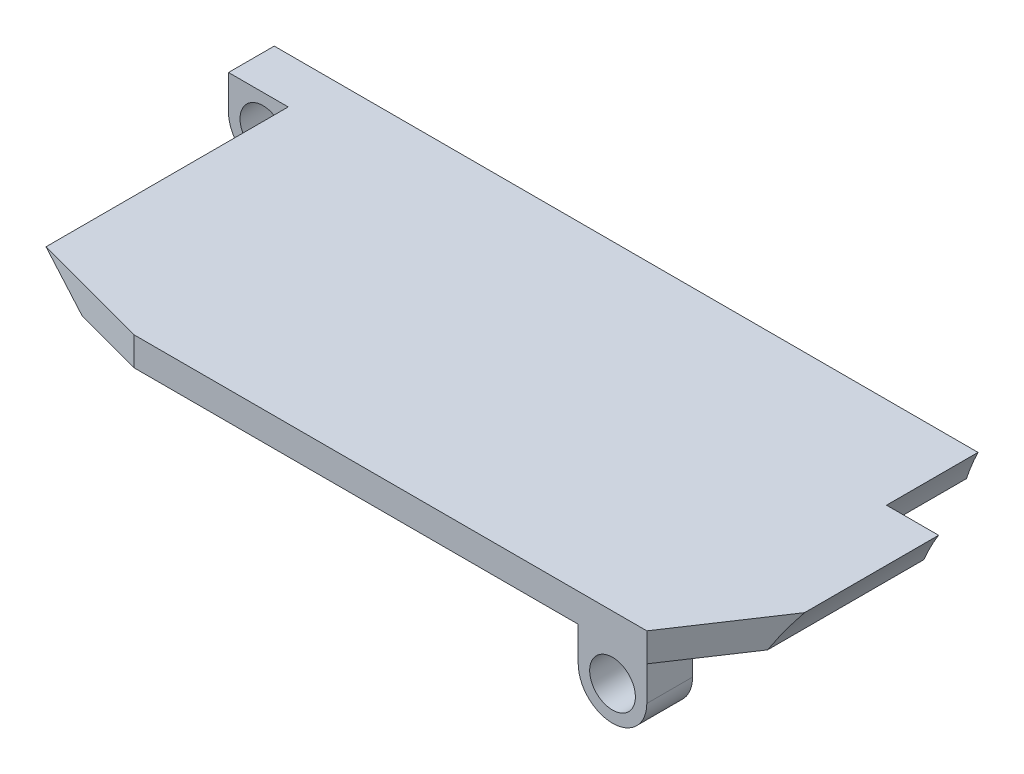
ISO-10303-21;
HEADER;
FILE_DESCRIPTION(('STEP AP214'),'2;1');
FILE_NAME('part.step','',(''),(''),'','','');
FILE_SCHEMA(('AUTOMOTIVE_DESIGN { 1 0 10303 214 1 1 1 1 }'));
ENDSEC;
DATA;
#1=APPLICATION_CONTEXT('core data for automotive mechanical design processes');
#2=APPLICATION_PROTOCOL_DEFINITION('international standard','automotive_design',2000,#1);
#3=PRODUCT_CONTEXT('',#1,'mechanical');
#4=PRODUCT('Part','Part','',(#3));
#5=PRODUCT_RELATED_PRODUCT_CATEGORY('part','',(#4));
#6=PRODUCT_DEFINITION_FORMATION('','',#4);
#7=PRODUCT_DEFINITION_CONTEXT('part definition',#1,'design');
#8=PRODUCT_DEFINITION('design','',#6,#7);
#9=PRODUCT_DEFINITION_SHAPE('','',#8);
#10=(LENGTH_UNIT() NAMED_UNIT(*) SI_UNIT(.MILLI.,.METRE.));
#11=(NAMED_UNIT(*) PLANE_ANGLE_UNIT() SI_UNIT($,.RADIAN.));
#12=(NAMED_UNIT(*) SI_UNIT($,.STERADIAN.) SOLID_ANGLE_UNIT());
#13=UNCERTAINTY_MEASURE_WITH_UNIT(LENGTH_MEASURE(1.E-05),#10,'distance_accuracy_value','');
#14=(GEOMETRIC_REPRESENTATION_CONTEXT(3) GLOBAL_UNCERTAINTY_ASSIGNED_CONTEXT((#13)) GLOBAL_UNIT_ASSIGNED_CONTEXT((#10,
#11,#12)) REPRESENTATION_CONTEXT('',''));
#15=CARTESIAN_POINT('',(0.,0.,0.));
#16=DIRECTION('',(0.,0.,1.));
#17=DIRECTION('',(1.,0.,0.));
#18=AXIS2_PLACEMENT_3D('',#15,#16,#17);
#19=CARTESIAN_POINT('',(-14.6132968385494,-25.3109725904531,-16.));
#20=DIRECTION('',(0.500000000000001,0.866025403784438,0.));
#21=DIRECTION('',(0.866025403784438,-0.500000000000001,0.));
#22=AXIS2_PLACEMENT_3D('',#19,#20,#21);
#23=PLANE('',#22);
#24=DIRECTION('',(0.866025403784438,-0.500000000000001,0.));
#25=VECTOR('',#24,1.);
#26=CARTESIAN_POINT('',(-14.6132968385494,-25.3109725904531,-14.));
#27=LINE('',#26,#25);
#28=CARTESIAN_POINT('',(-15.5849298668677,-24.75,-14.));
#29=VERTEX_POINT('',#28);
#30=CARTESIAN_POINT('',(-13.4198663574066,-26.,-14.));
#31=VERTEX_POINT('',#30);
#32=EDGE_CURVE('E182',#29,#31,#27,.T.);
#33=ORIENTED_EDGE('',*,*,#32,.T.);
#34=DIRECTION('',(0.,0.,1.));
#35=VECTOR('',#34,1.);
#36=CARTESIAN_POINT('',(-13.4198663574066,-26.,-16.));
#37=LINE('',#36,#35);
#38=CARTESIAN_POINT('',(-13.4198663574066,-26.,-2.82810536129617));
#39=VERTEX_POINT('',#38);
#40=EDGE_CURVE('E256',#31,#39,#37,.T.);
#41=ORIENTED_EDGE('',*,*,#40,.T.);
#42=DIRECTION('',(0.843610022961952,-0.48705847384815,0.22604462437945));
#43=VECTOR('',#42,1.);
#44=CARTESIAN_POINT('',(-17.0641119412203,-23.8959938311921,-3.80457802249971));
#45=LINE('',#44,#43);
#46=CARTESIAN_POINT('',(-15.5849298668677,-24.75,-3.40823238021835));
#47=VERTEX_POINT('',#46);
#48=EDGE_CURVE('E213',#47,#39,#45,.T.);
#49=ORIENTED_EDGE('',*,*,#48,.F.);
#50=DIRECTION('',(0.,0.,1.));
#51=VECTOR('',#50,1.);
#52=CARTESIAN_POINT('',(-15.5849298668677,-24.75,-16.));
#53=LINE('',#52,#51);
#54=EDGE_CURVE('E260',#29,#47,#53,.T.);
#55=ORIENTED_EDGE('',*,*,#54,.F.);
#56=EDGE_LOOP('',(#33,#41,#49,#55));
#57=FACE_BOUND('',#56,.T.);
#58=ADVANCED_FACE('F34',(#57),#23,.F.);
#59=CARTESIAN_POINT('',(22.5,-29.5,-16.));
#60=DIRECTION('',(0.,0.,1.));
#61=DIRECTION('',(1.,0.,0.));
#62=AXIS2_PLACEMENT_3D('',#59,#60,#61);
#63=CYLINDRICAL_SURFACE('',#62,9.00000000000001);
#64=CARTESIAN_POINT('',(22.5,-29.5,-17.605551275464));
#65=DIRECTION('',(0.832050294337844,0.,0.554700196225229));
#66=DIRECTION('',(-0.554700196225229,0.,0.832050294337844));
#67=AXIS2_PLACEMENT_3D('',#64,#65,#66);
#68=ELLIPSE('',#67,16.224980739588,9.00000000000001);
#69=CARTESIAN_POINT('',(14.8555575742897,-24.75,-6.1388876368985));
#70=VERTEX_POINT('',#69);
#71=CARTESIAN_POINT('',(14.2084380241115,-26.,-5.16820831163123));
#72=VERTEX_POINT('',#71);
#73=EDGE_CURVE('E222',#70,#72,#68,.T.);
#74=ORIENTED_EDGE('',*,*,#73,.T.);
#75=DIRECTION('',(0.,0.,1.));
#76=VECTOR('',#75,1.);
#77=CARTESIAN_POINT('',(14.2084380241115,-26.,-16.));
#78=LINE('',#77,#76);
#79=CARTESIAN_POINT('',(14.2084380241115,-26.,-12.));
#80=VERTEX_POINT('',#79);
#81=EDGE_CURVE('E249',#80,#72,#78,.T.);
#82=ORIENTED_EDGE('',*,*,#81,.F.);
#83=CARTESIAN_POINT('',(22.5,-29.5,-12.));
#84=DIRECTION('',(0.,0.,1.));
#85=DIRECTION('',(-1.,0.,0.));
#86=AXIS2_PLACEMENT_3D('',#83,#84,#85);
#87=CIRCLE('',#86,9.00000000000001);
#88=CARTESIAN_POINT('',(14.8555575742897,-24.75,-12.));
#89=VERTEX_POINT('',#88);
#90=EDGE_CURVE('E238',#89,#80,#87,.T.);
#91=ORIENTED_EDGE('',*,*,#90,.F.);
#92=DIRECTION('',(0.,0.,1.));
#93=VECTOR('',#92,1.);
#94=CARTESIAN_POINT('',(14.8555575742897,-24.75,-16.));
#95=LINE('',#94,#93);
#96=EDGE_CURVE('E42',#89,#70,#95,.T.);
#97=ORIENTED_EDGE('',*,*,#96,.T.);
#98=EDGE_LOOP('',(#74,#82,#91,#97));
#99=FACE_BOUND('',#98,.T.);
#100=ADVANCED_FACE('F36',(#99),#63,.F.);
#101=CARTESIAN_POINT('',(0.,-24.75,-16.));
#102=DIRECTION('',(0.,1.,0.));
#103=DIRECTION('',(1.,0.,0.));
#104=AXIS2_PLACEMENT_3D('',#101,#102,#103);
#105=PLANE('',#104);
#106=DIRECTION('',(0.96592582628907,0.,0.258819045102514));
#107=VECTOR('',#106,1.);
#108=CARTESIAN_POINT('',(-10.329335075029,-24.75,-2.));
#109=LINE('',#108,#107);
#110=CARTESIAN_POINT('',(-10.329335075029,-24.75,-2.));
#111=VERTEX_POINT('',#110);
#112=EDGE_CURVE('E199',#47,#111,#109,.T.);
#113=ORIENTED_EDGE('',*,*,#112,.T.);
#114=DIRECTION('',(1.,0.,0.));
#115=VECTOR('',#114,1.);
#116=CARTESIAN_POINT('',(0.,-24.75,-2.));
#117=LINE('',#116,#115);
#118=CARTESIAN_POINT('',(12.0962991496907,-24.75,-2.));
#119=VERTEX_POINT('',#118);
#120=EDGE_CURVE('E241',#111,#119,#117,.T.);
#121=ORIENTED_EDGE('',*,*,#120,.T.);
#122=DIRECTION('',(0.554700196225229,0.,-0.832050294337844));
#123=VECTOR('',#122,1.);
#124=CARTESIAN_POINT('',(12.0962991496907,-24.75,-2.));
#125=LINE('',#124,#123);
#126=EDGE_CURVE('E216',#119,#70,#125,.T.);
#127=ORIENTED_EDGE('',*,*,#126,.T.);
#128=ORIENTED_EDGE('',*,*,#96,.F.);
#129=DIRECTION('',(-1.,0.,0.));
#130=VECTOR('',#129,1.);
#131=CARTESIAN_POINT('',(12.5784325835078,-24.75,-12.));
#132=LINE('',#131,#130);
#133=CARTESIAN_POINT('',(12.5784325835078,-24.75,-12.));
#134=VERTEX_POINT('',#133);
#135=EDGE_CURVE('E228',#89,#134,#132,.T.);
#136=ORIENTED_EDGE('',*,*,#135,.T.);
#137=DIRECTION('',(0.,0.,-1.));
#138=VECTOR('',#137,1.);
#139=CARTESIAN_POINT('',(12.5784325835078,-24.75,-12.));
#140=LINE('',#139,#138);
#141=CARTESIAN_POINT('',(12.5784325835078,-24.75,-16.));
#142=VERTEX_POINT('',#141);
#143=EDGE_CURVE('E231',#134,#142,#140,.T.);
#144=ORIENTED_EDGE('',*,*,#143,.T.);
#145=DIRECTION('',(1.,0.,0.));
#146=VECTOR('',#145,1.);
#147=CARTESIAN_POINT('',(0.,-24.75,-16.));
#148=LINE('',#147,#146);
#149=CARTESIAN_POINT('',(-18.1957444455323,-24.75,-16.));
#150=VERTEX_POINT('',#149);
#151=EDGE_CURVE('E242',#150,#142,#148,.T.);
#152=ORIENTED_EDGE('',*,*,#151,.F.);
#153=DIRECTION('',(0.,0.,-1.));
#154=VECTOR('',#153,1.);
#155=CARTESIAN_POINT('',(-18.1957444455323,-24.75,-14.));
#156=LINE('',#155,#154);
#157=CARTESIAN_POINT('',(-18.1957444455323,-24.75,-14.));
#158=VERTEX_POINT('',#157);
#159=EDGE_CURVE('E185',#158,#150,#156,.T.);
#160=ORIENTED_EDGE('',*,*,#159,.F.);
#161=DIRECTION('',(-1.,0.,0.));
#162=VECTOR('',#161,1.);
#163=CARTESIAN_POINT('',(0.,-24.75,-14.));
#164=LINE('',#163,#162);
#165=EDGE_CURVE('E170',#29,#158,#164,.T.);
#166=ORIENTED_EDGE('',*,*,#165,.F.);
#167=ORIENTED_EDGE('',*,*,#54,.T.);
#168=EDGE_LOOP('',(#113,#121,#127,#128,#136,#144,#152,#160,#166,#167));
#169=FACE_BOUND('',#168,.T.);
#170=ADVANCED_FACE('F280',(#169),#105,.T.);
#171=CARTESIAN_POINT('',(0.,-26.,-16.));
#172=DIRECTION('',(0.,1.,0.));
#173=DIRECTION('',(0.,0.,-1.));
#174=AXIS2_PLACEMENT_3D('',#171,#172,#173);
#175=PLANE('',#174);
#176=DIRECTION('',(-1.,0.,0.));
#177=VECTOR('',#176,1.);
#178=CARTESIAN_POINT('',(0.,-26.,-4.));
#179=LINE('',#178,#177);
#180=CARTESIAN_POINT('',(12.0962991496907,-26.,-4.));
#181=VERTEX_POINT('',#180);
#182=CARTESIAN_POINT('',(9.09629914969067,-26.,-4.));
#183=VERTEX_POINT('',#182);
#184=EDGE_CURVE('E157',#181,#183,#179,.T.);
#185=ORIENTED_EDGE('',*,*,#184,.T.);
#186=DIRECTION('',(0.,0.,1.));
#187=VECTOR('',#186,1.);
#188=CARTESIAN_POINT('',(9.09629914969067,-26.,-4.));
#189=LINE('',#188,#187);
#190=CARTESIAN_POINT('',(9.09629914969067,-26.,-2.));
#191=VERTEX_POINT('',#190);
#192=EDGE_CURVE('E165',#183,#191,#189,.T.);
#193=ORIENTED_EDGE('',*,*,#192,.T.);
#194=DIRECTION('',(1.,0.,0.));
#195=VECTOR('',#194,1.);
#196=CARTESIAN_POINT('',(0.,-26.,-2.));
#197=LINE('',#196,#195);
#198=CARTESIAN_POINT('',(-10.329335075029,-26.,-2.));
#199=VERTEX_POINT('',#198);
#200=EDGE_CURVE('E246',#199,#191,#197,.T.);
#201=ORIENTED_EDGE('',*,*,#200,.F.);
#202=DIRECTION('',(0.96592582628907,0.,0.258819045102514));
#203=VECTOR('',#202,1.);
#204=CARTESIAN_POINT('',(-10.329335075029,-26.,-2.));
#205=LINE('',#204,#203);
#206=EDGE_CURVE('E206',#39,#199,#205,.T.);
#207=ORIENTED_EDGE('',*,*,#206,.F.);
#208=ORIENTED_EDGE('',*,*,#40,.F.);
#209=CARTESIAN_POINT('',(-13.4198663574066,-26.,-16.));
#210=VERTEX_POINT('',#209);
#211=EDGE_CURVE('E257',#210,#31,#37,.T.);
#212=ORIENTED_EDGE('',*,*,#211,.F.);
#213=DIRECTION('',(1.,0.,0.));
#214=VECTOR('',#213,1.);
#215=CARTESIAN_POINT('',(0.,-26.,-16.));
#216=LINE('',#215,#214);
#217=CARTESIAN_POINT('',(12.0716731926929,-26.,-16.));
#218=VERTEX_POINT('',#217);
#219=EDGE_CURVE('E245',#210,#218,#216,.T.);
#220=ORIENTED_EDGE('',*,*,#219,.T.);
#221=DIRECTION('',(0.,0.,-1.));
#222=VECTOR('',#221,1.);
#223=CARTESIAN_POINT('',(12.0716731926929,-26.,-12.));
#224=LINE('',#223,#222);
#225=CARTESIAN_POINT('',(12.0716731926929,-26.,-12.));
#226=VERTEX_POINT('',#225);
#227=EDGE_CURVE('E235',#226,#218,#224,.T.);
#228=ORIENTED_EDGE('',*,*,#227,.F.);
#229=DIRECTION('',(1.,0.,0.));
#230=VECTOR('',#229,1.);
#231=CARTESIAN_POINT('',(0.,-26.,-12.));
#232=LINE('',#231,#230);
#233=EDGE_CURVE('E11',#226,#80,#232,.T.);
#234=ORIENTED_EDGE('',*,*,#233,.T.);
#235=ORIENTED_EDGE('',*,*,#81,.T.);
#236=DIRECTION('',(0.554700196225229,0.,-0.832050294337844));
#237=VECTOR('',#236,1.);
#238=CARTESIAN_POINT('',(12.0962991496907,-26.,-2.));
#239=LINE('',#238,#237);
#240=CARTESIAN_POINT('',(12.0962991496907,-26.,-2.));
#241=VERTEX_POINT('',#240);
#242=EDGE_CURVE('E217',#241,#72,#239,.T.);
#243=ORIENTED_EDGE('',*,*,#242,.F.);
#244=DIRECTION('',(0.,0.,1.));
#245=VECTOR('',#244,1.);
#246=CARTESIAN_POINT('',(12.0962991496907,-26.,-4.));
#247=LINE('',#246,#245);
#248=EDGE_CURVE('E190',#181,#241,#247,.T.);
#249=ORIENTED_EDGE('',*,*,#248,.F.);
#250=EDGE_LOOP('',(#185,#193,#201,#207,#208,#212,#220,#228,#234,#235,#243,#249));
#251=FACE_BOUND('',#250,.T.);
#252=ADVANCED_FACE('F274',(#251),#175,.F.);
#253=CARTESIAN_POINT('',(0.,0.,-16.));
#254=DIRECTION('',(0.,0.,-1.));
#255=DIRECTION('',(-1.,0.,0.));
#256=AXIS2_PLACEMENT_3D('',#253,#254,#255);
#257=PLANE('',#256);
#258=CARTESIAN_POINT('',(-16.6917910527879,-26.25,-16.));
#259=DIRECTION('',(0.,0.,1.));
#260=DIRECTION('',(-1.,0.,0.));
#261=AXIS2_PLACEMENT_3D('',#258,#259,#260);
#262=CIRCLE('',#261,1.);
#263=CARTESIAN_POINT('',(-17.6917910527879,-26.25,-16.));
#264=VERTEX_POINT('',#263);
#265=EDGE_CURVE('E326',#264,#264,#262,.T.);
#266=ORIENTED_EDGE('',*,*,#265,.T.);
#267=EDGE_LOOP('',(#266));
#268=FACE_BOUND('',#267,.T.);
#269=CARTESIAN_POINT('',(22.5,-29.5,-16.));
#270=DIRECTION('',(0.,0.,1.));
#271=DIRECTION('',(-1.,0.,0.));
#272=AXIS2_PLACEMENT_3D('',#269,#270,#271);
#273=CIRCLE('',#272,11.);
#274=EDGE_CURVE('E225',#142,#218,#273,.T.);
#275=ORIENTED_EDGE('',*,*,#274,.T.);
#276=ORIENTED_EDGE('',*,*,#219,.F.);
#277=DIRECTION('',(0.988926049356473,0.148409126755062,0.));
#278=VECTOR('',#277,1.);
#279=CARTESIAN_POINT('',(3.5203307714882,-23.4577675807065,-16.));
#280=LINE('',#279,#278);
#281=CARTESIAN_POINT('',(-15.0857444455323,-26.25,-16.));
#282=VERTEX_POINT('',#281);
#283=EDGE_CURVE('E174',#282,#210,#280,.T.);
#284=ORIENTED_EDGE('',*,*,#283,.F.);
#285=DIRECTION('',(1.,0.,0.));
#286=VECTOR('',#285,1.);
#287=CARTESIAN_POINT('',(0.,-26.25,-16.));
#288=LINE('',#287,#286);
#289=CARTESIAN_POINT('',(-15.1957444455323,-26.25,-16.));
#290=VERTEX_POINT('',#289);
#291=EDGE_CURVE('E193',#290,#282,#288,.T.);
#292=ORIENTED_EDGE('',*,*,#291,.F.);
#293=CARTESIAN_POINT('',(-16.6957444455323,-26.25,-16.));
#294=DIRECTION('',(0.,0.,1.));
#295=DIRECTION('',(-1.,0.,0.));
#296=AXIS2_PLACEMENT_3D('',#293,#294,#295);
#297=CIRCLE('',#296,1.5);
#298=CARTESIAN_POINT('',(-18.1957444455323,-26.25,-16.));
#299=VERTEX_POINT('',#298);
#300=EDGE_CURVE('E189',#299,#290,#297,.T.);
#301=ORIENTED_EDGE('',*,*,#300,.F.);
#302=DIRECTION('',(0.,-1.,0.));
#303=VECTOR('',#302,1.);
#304=CARTESIAN_POINT('',(-18.1957444455323,0.,-16.));
#305=LINE('',#304,#303);
#306=EDGE_CURVE('E186',#150,#299,#305,.T.);
#307=ORIENTED_EDGE('',*,*,#306,.F.);
#308=ORIENTED_EDGE('',*,*,#151,.T.);
#309=EDGE_LOOP('',(#275,#276,#284,#292,#301,#307,#308));
#310=FACE_BOUND('',#309,.T.);
#311=ADVANCED_FACE('F287',(#268,#310),#257,.T.);
#312=CARTESIAN_POINT('',(0.,0.,-2.));
#313=DIRECTION('',(0.,0.,-1.));
#314=DIRECTION('',(-1.,0.,0.));
#315=AXIS2_PLACEMENT_3D('',#312,#313,#314);
#316=PLANE('',#315);
#317=CARTESIAN_POINT('',(10.5962991496907,-27.5,-2.));
#318=DIRECTION('',(0.,0.,-1.));
#319=DIRECTION('',(1.,0.,0.));
#320=AXIS2_PLACEMENT_3D('',#317,#318,#319);
#321=CIRCLE('',#320,0.999999999999987);
#322=CARTESIAN_POINT('',(11.5962991496907,-27.5,-2.));
#323=VERTEX_POINT('',#322);
#324=EDGE_CURVE('E332',#323,#323,#321,.T.);
#325=ORIENTED_EDGE('',*,*,#324,.T.);
#326=EDGE_LOOP('',(#325));
#327=FACE_BOUND('',#326,.T.);
#328=ORIENTED_EDGE('',*,*,#200,.T.);
#329=DIRECTION('',(0.,1.,0.));
#330=VECTOR('',#329,1.);
#331=CARTESIAN_POINT('',(9.09629914969062,0.,-2.));
#332=LINE('',#331,#330);
#333=CARTESIAN_POINT('',(9.09629914969068,-27.5,-2.));
#334=VERTEX_POINT('',#333);
#335=EDGE_CURVE('E158',#334,#191,#332,.T.);
#336=ORIENTED_EDGE('',*,*,#335,.F.);
#337=CARTESIAN_POINT('',(10.5962991496907,-27.5,-2.));
#338=DIRECTION('',(0.,0.,-1.));
#339=DIRECTION('',(1.,0.,0.));
#340=AXIS2_PLACEMENT_3D('',#337,#338,#339);
#341=CIRCLE('',#340,1.5);
#342=CARTESIAN_POINT('',(12.0962991496907,-27.5,-2.));
#343=VERTEX_POINT('',#342);
#344=EDGE_CURVE('E316',#343,#334,#341,.T.);
#345=ORIENTED_EDGE('',*,*,#344,.F.);
#346=DIRECTION('',(0.,-1.,0.));
#347=VECTOR('',#346,1.);
#348=CARTESIAN_POINT('',(12.0962991496907,0.,-2.));
#349=LINE('',#348,#347);
#350=EDGE_CURVE('E162',#241,#343,#349,.T.);
#351=ORIENTED_EDGE('',*,*,#350,.F.);
#352=DIRECTION('',(0.,1.,0.));
#353=VECTOR('',#352,1.);
#354=CARTESIAN_POINT('',(12.0962991496907,-26.,-2.));
#355=LINE('',#354,#353);
#356=EDGE_CURVE('E219',#241,#119,#355,.T.);
#357=ORIENTED_EDGE('',*,*,#356,.T.);
#358=ORIENTED_EDGE('',*,*,#120,.F.);
#359=DIRECTION('',(0.,1.,0.));
#360=VECTOR('',#359,1.);
#361=CARTESIAN_POINT('',(-10.329335075029,-26.,-2.));
#362=LINE('',#361,#360);
#363=EDGE_CURVE('E209',#199,#111,#362,.T.);
#364=ORIENTED_EDGE('',*,*,#363,.F.);
#365=EDGE_LOOP('',(#328,#336,#345,#351,#357,#358,#364));
#366=FACE_BOUND('',#365,.T.);
#367=ADVANCED_FACE('F314',(#327,#366),#316,.F.);
#368=CARTESIAN_POINT('',(22.5,-29.5,-12.));
#369=DIRECTION('',(0.,0.,-1.));
#370=DIRECTION('',(-1.,0.,0.));
#371=AXIS2_PLACEMENT_3D('',#368,#369,#370);
#372=CYLINDRICAL_SURFACE('',#371,11.);
#373=CARTESIAN_POINT('',(22.5,-29.5,-12.));
#374=DIRECTION('',(0.,0.,1.));
#375=DIRECTION('',(-1.,0.,0.));
#376=AXIS2_PLACEMENT_3D('',#373,#374,#375);
#377=CIRCLE('',#376,11.);
#378=EDGE_CURVE('E226',#134,#226,#377,.T.);
#379=ORIENTED_EDGE('',*,*,#378,.T.);
#380=ORIENTED_EDGE('',*,*,#227,.T.);
#381=ORIENTED_EDGE('',*,*,#274,.F.);
#382=ORIENTED_EDGE('',*,*,#143,.F.);
#383=EDGE_LOOP('',(#379,#380,#381,#382));
#384=FACE_BOUND('',#383,.T.);
#385=ADVANCED_FACE('F284',(#384),#372,.F.);
#386=CARTESIAN_POINT('',(22.5,-29.5,-12.));
#387=DIRECTION('',(0.,0.,-1.));
#388=DIRECTION('',(-1.,0.,0.));
#389=AXIS2_PLACEMENT_3D('',#386,#387,#388);
#390=PLANE('',#389);
#391=ORIENTED_EDGE('',*,*,#135,.F.);
#392=ORIENTED_EDGE('',*,*,#90,.T.);
#393=ORIENTED_EDGE('',*,*,#233,.F.);
#394=ORIENTED_EDGE('',*,*,#378,.F.);
#395=EDGE_LOOP('',(#391,#392,#393,#394));
#396=FACE_BOUND('',#395,.T.);
#397=ADVANCED_FACE('F278',(#396),#390,.T.);
#398=CARTESIAN_POINT('',(12.0962991496907,-26.,-2.));
#399=DIRECTION('',(-0.832050294337844,0.,-0.554700196225229));
#400=DIRECTION('',(-0.554700196225229,0.,0.832050294337844));
#401=AXIS2_PLACEMENT_3D('',#398,#399,#400);
#402=PLANE('',#401);
#403=ORIENTED_EDGE('',*,*,#73,.F.);
#404=ORIENTED_EDGE('',*,*,#126,.F.);
#405=ORIENTED_EDGE('',*,*,#356,.F.);
#406=ORIENTED_EDGE('',*,*,#242,.T.);
#407=EDGE_LOOP('',(#403,#404,#405,#406));
#408=FACE_BOUND('',#407,.T.);
#409=ADVANCED_FACE('F271',(#408),#402,.F.);
#410=CARTESIAN_POINT('',(-10.329335075029,-26.,-2.));
#411=DIRECTION('',(0.258819045102514,0.,-0.96592582628907));
#412=DIRECTION('',(-0.96592582628907,0.,-0.258819045102514));
#413=AXIS2_PLACEMENT_3D('',#410,#411,#412);
#414=PLANE('',#413);
#415=ORIENTED_EDGE('',*,*,#112,.F.);
#416=ORIENTED_EDGE('',*,*,#48,.T.);
#417=ORIENTED_EDGE('',*,*,#206,.T.);
#418=ORIENTED_EDGE('',*,*,#363,.T.);
#419=EDGE_LOOP('',(#415,#416,#417,#418));
#420=FACE_BOUND('',#419,.T.);
#421=ADVANCED_FACE('F311',(#420),#414,.F.);
#422=CARTESIAN_POINT('',(3.5203307714882,-23.4577675807065,-14.));
#423=DIRECTION('',(0.148409126755062,-0.988926049356472,0.));
#424=DIRECTION('',(-0.988926049356472,-0.148409126755062,0.));
#425=AXIS2_PLACEMENT_3D('',#422,#423,#424);
#426=PLANE('',#425);
#427=ORIENTED_EDGE('',*,*,#283,.T.);
#428=ORIENTED_EDGE('',*,*,#211,.T.);
#429=DIRECTION('',(0.988926049356473,0.148409126755062,0.));
#430=VECTOR('',#429,1.);
#431=CARTESIAN_POINT('',(3.5203307714882,-23.4577675807065,-14.));
#432=LINE('',#431,#430);
#433=CARTESIAN_POINT('',(-15.0857444455323,-26.25,-14.));
#434=VERTEX_POINT('',#433);
#435=EDGE_CURVE('E180',#434,#31,#432,.T.);
#436=ORIENTED_EDGE('',*,*,#435,.F.);
#437=DIRECTION('',(0.,0.,-1.));
#438=VECTOR('',#437,1.);
#439=CARTESIAN_POINT('',(-15.0857444455323,-26.25,-14.));
#440=LINE('',#439,#438);
#441=EDGE_CURVE('E197',#434,#282,#440,.T.);
#442=ORIENTED_EDGE('',*,*,#441,.T.);
#443=EDGE_LOOP('',(#427,#428,#436,#442));
#444=FACE_BOUND('',#443,.T.);
#445=ADVANCED_FACE('F306',(#444),#426,.T.);
#446=CARTESIAN_POINT('',(0.,-26.25,-14.));
#447=DIRECTION('',(0.,-1.,0.));
#448=DIRECTION('',(0.,0.,1.));
#449=AXIS2_PLACEMENT_3D('',#446,#447,#448);
#450=PLANE('',#449);
#451=ORIENTED_EDGE('',*,*,#291,.T.);
#452=ORIENTED_EDGE('',*,*,#441,.F.);
#453=DIRECTION('',(1.,0.,0.));
#454=VECTOR('',#453,1.);
#455=CARTESIAN_POINT('',(0.,-26.25,-14.));
#456=LINE('',#455,#454);
#457=CARTESIAN_POINT('',(-15.1957444455323,-26.25,-14.));
#458=VERTEX_POINT('',#457);
#459=EDGE_CURVE('E178',#458,#434,#456,.T.);
#460=ORIENTED_EDGE('',*,*,#459,.F.);
#461=DIRECTION('',(0.,0.,-1.));
#462=VECTOR('',#461,1.);
#463=CARTESIAN_POINT('',(-15.1957444455323,-26.25,-14.));
#464=LINE('',#463,#462);
#465=EDGE_CURVE('E200',#458,#290,#464,.T.);
#466=ORIENTED_EDGE('',*,*,#465,.T.);
#467=EDGE_LOOP('',(#451,#452,#460,#466));
#468=FACE_BOUND('',#467,.T.);
#469=ADVANCED_FACE('F388',(#468),#450,.T.);
#470=CARTESIAN_POINT('',(-16.6957444455323,-26.25,-14.));
#471=DIRECTION('',(0.,0.,-1.));
#472=DIRECTION('',(-1.,0.,0.));
#473=AXIS2_PLACEMENT_3D('',#470,#471,#472);
#474=CYLINDRICAL_SURFACE('',#473,1.5);
#475=ORIENTED_EDGE('',*,*,#300,.T.);
#476=ORIENTED_EDGE('',*,*,#465,.F.);
#477=CARTESIAN_POINT('',(-16.6957444455323,-26.25,-14.));
#478=DIRECTION('',(0.,0.,1.));
#479=DIRECTION('',(-1.,0.,0.));
#480=AXIS2_PLACEMENT_3D('',#477,#478,#479);
#481=CIRCLE('',#480,1.5);
#482=CARTESIAN_POINT('',(-18.1957444455323,-26.25,-14.));
#483=VERTEX_POINT('',#482);
#484=EDGE_CURVE('E176',#483,#458,#481,.T.);
#485=ORIENTED_EDGE('',*,*,#484,.F.);
#486=DIRECTION('',(0.,0.,-1.));
#487=VECTOR('',#486,1.);
#488=CARTESIAN_POINT('',(-18.1957444455323,-26.25,-14.));
#489=LINE('',#488,#487);
#490=EDGE_CURVE('E202',#483,#299,#489,.T.);
#491=ORIENTED_EDGE('',*,*,#490,.T.);
#492=EDGE_LOOP('',(#475,#476,#485,#491));
#493=FACE_BOUND('',#492,.T.);
#494=ADVANCED_FACE('F385',(#493),#474,.T.);
#495=CARTESIAN_POINT('',(-18.1957444455323,0.,-14.));
#496=DIRECTION('',(-1.,0.,0.));
#497=DIRECTION('',(0.,0.,1.));
#498=AXIS2_PLACEMENT_3D('',#495,#496,#497);
#499=PLANE('',#498);
#500=ORIENTED_EDGE('',*,*,#306,.T.);
#501=ORIENTED_EDGE('',*,*,#490,.F.);
#502=DIRECTION('',(0.,-1.,0.));
#503=VECTOR('',#502,1.);
#504=CARTESIAN_POINT('',(-18.1957444455323,0.,-14.));
#505=LINE('',#504,#503);
#506=EDGE_CURVE('E173',#158,#483,#505,.T.);
#507=ORIENTED_EDGE('',*,*,#506,.F.);
#508=ORIENTED_EDGE('',*,*,#159,.T.);
#509=EDGE_LOOP('',(#500,#501,#507,#508));
#510=FACE_BOUND('',#509,.T.);
#511=ADVANCED_FACE('F292',(#510),#499,.T.);
#512=CARTESIAN_POINT('',(0.,0.,-14.));
#513=DIRECTION('',(0.,0.,-1.));
#514=DIRECTION('',(-1.,0.,0.));
#515=AXIS2_PLACEMENT_3D('',#512,#513,#514);
#516=PLANE('',#515);
#517=CARTESIAN_POINT('',(-16.6917910527879,-26.25,-14.));
#518=DIRECTION('',(0.,0.,1.));
#519=DIRECTION('',(-1.,0.,0.));
#520=AXIS2_PLACEMENT_3D('',#517,#518,#519);
#521=CIRCLE('',#520,0.999999999999999);
#522=CARTESIAN_POINT('',(-17.6917910527879,-26.25,-14.));
#523=VERTEX_POINT('',#522);
#524=EDGE_CURVE('E317',#523,#523,#521,.T.);
#525=ORIENTED_EDGE('',*,*,#524,.F.);
#526=EDGE_LOOP('',(#525));
#527=FACE_BOUND('',#526,.T.);
#528=ORIENTED_EDGE('',*,*,#165,.T.);
#529=ORIENTED_EDGE('',*,*,#506,.T.);
#530=ORIENTED_EDGE('',*,*,#484,.T.);
#531=ORIENTED_EDGE('',*,*,#459,.T.);
#532=ORIENTED_EDGE('',*,*,#435,.T.);
#533=ORIENTED_EDGE('',*,*,#32,.F.);
#534=EDGE_LOOP('',(#528,#529,#530,#531,#532,#533));
#535=FACE_BOUND('',#534,.T.);
#536=ADVANCED_FACE('F299',(#527,#535),#516,.F.);
#537=CARTESIAN_POINT('',(12.0962991496907,0.,-4.));
#538=DIRECTION('',(1.,0.,0.));
#539=DIRECTION('',(0.,0.,-1.));
#540=AXIS2_PLACEMENT_3D('',#537,#538,#539);
#541=PLANE('',#540);
#542=ORIENTED_EDGE('',*,*,#350,.T.);
#543=DIRECTION('',(0.,0.,1.));
#544=VECTOR('',#543,1.);
#545=CARTESIAN_POINT('',(12.0962991496907,-27.5,-4.));
#546=LINE('',#545,#544);
#547=CARTESIAN_POINT('',(12.0962991496907,-27.5,-4.));
#548=VERTEX_POINT('',#547);
#549=EDGE_CURVE('E151',#548,#343,#546,.T.);
#550=ORIENTED_EDGE('',*,*,#549,.F.);
#551=DIRECTION('',(0.,-1.,0.));
#552=VECTOR('',#551,1.);
#553=CARTESIAN_POINT('',(12.0962991496907,0.,-4.));
#554=LINE('',#553,#552);
#555=EDGE_CURVE('E57',#181,#548,#554,.T.);
#556=ORIENTED_EDGE('',*,*,#555,.F.);
#557=ORIENTED_EDGE('',*,*,#248,.T.);
#558=EDGE_LOOP('',(#542,#550,#556,#557));
#559=FACE_BOUND('',#558,.T.);
#560=ADVANCED_FACE('F160',(#559),#541,.T.);
#561=CARTESIAN_POINT('',(9.09629914969062,0.,-4.));
#562=DIRECTION('',(-1.,0.,0.));
#563=DIRECTION('',(0.,1.,0.));
#564=AXIS2_PLACEMENT_3D('',#561,#562,#563);
#565=PLANE('',#564);
#566=ORIENTED_EDGE('',*,*,#335,.T.);
#567=ORIENTED_EDGE('',*,*,#192,.F.);
#568=DIRECTION('',(0.,1.,0.));
#569=VECTOR('',#568,1.);
#570=CARTESIAN_POINT('',(9.09629914969062,0.,-4.));
#571=LINE('',#570,#569);
#572=CARTESIAN_POINT('',(9.09629914969068,-27.5,-4.));
#573=VERTEX_POINT('',#572);
#574=EDGE_CURVE('E49',#573,#183,#571,.T.);
#575=ORIENTED_EDGE('',*,*,#574,.F.);
#576=DIRECTION('',(0.,0.,1.));
#577=VECTOR('',#576,1.);
#578=CARTESIAN_POINT('',(9.09629914969068,-27.5,-4.));
#579=LINE('',#578,#577);
#580=EDGE_CURVE('E153',#573,#334,#579,.T.);
#581=ORIENTED_EDGE('',*,*,#580,.T.);
#582=EDGE_LOOP('',(#566,#567,#575,#581));
#583=FACE_BOUND('',#582,.T.);
#584=ADVANCED_FACE('F352',(#583),#565,.T.);
#585=CARTESIAN_POINT('',(10.5962991496907,-27.5,-4.));
#586=DIRECTION('',(0.,0.,1.));
#587=DIRECTION('',(1.,0.,0.));
#588=AXIS2_PLACEMENT_3D('',#585,#586,#587);
#589=CYLINDRICAL_SURFACE('',#588,1.5);
#590=ORIENTED_EDGE('',*,*,#344,.T.);
#591=ORIENTED_EDGE('',*,*,#580,.F.);
#592=CARTESIAN_POINT('',(10.5962991496907,-27.5,-4.));
#593=DIRECTION('',(0.,0.,-1.));
#594=DIRECTION('',(1.,0.,0.));
#595=AXIS2_PLACEMENT_3D('',#592,#593,#594);
#596=CIRCLE('',#595,1.5);
#597=EDGE_CURVE('E148',#548,#573,#596,.T.);
#598=ORIENTED_EDGE('',*,*,#597,.F.);
#599=ORIENTED_EDGE('',*,*,#549,.T.);
#600=EDGE_LOOP('',(#590,#591,#598,#599));
#601=FACE_BOUND('',#600,.T.);
#602=ADVANCED_FACE('F150',(#601),#589,.T.);
#603=CARTESIAN_POINT('',(0.,0.,-4.));
#604=DIRECTION('',(0.,0.,1.));
#605=DIRECTION('',(1.,0.,0.));
#606=AXIS2_PLACEMENT_3D('',#603,#604,#605);
#607=PLANE('',#606);
#608=CARTESIAN_POINT('',(10.5962991496907,-27.5,-4.));
#609=DIRECTION('',(0.,0.,-1.));
#610=DIRECTION('',(1.,0.,0.));
#611=AXIS2_PLACEMENT_3D('',#608,#609,#610);
#612=CIRCLE('',#611,0.999999999999993);
#613=CARTESIAN_POINT('',(11.5962991496907,-27.5,-4.));
#614=VERTEX_POINT('',#613);
#615=EDGE_CURVE('E329',#614,#614,#612,.T.);
#616=ORIENTED_EDGE('',*,*,#615,.F.);
#617=EDGE_LOOP('',(#616));
#618=FACE_BOUND('',#617,.T.);
#619=ORIENTED_EDGE('',*,*,#555,.T.);
#620=ORIENTED_EDGE('',*,*,#597,.T.);
#621=ORIENTED_EDGE('',*,*,#574,.T.);
#622=ORIENTED_EDGE('',*,*,#184,.F.);
#623=EDGE_LOOP('',(#619,#620,#621,#622));
#624=FACE_BOUND('',#623,.T.);
#625=ADVANCED_FACE('F155',(#618,#624),#607,.F.);
#626=CARTESIAN_POINT('',(-16.6917910527879,-26.25,-16.));
#627=DIRECTION('',(0.,0.,-1.));
#628=DIRECTION('',(-1.,0.,0.));
#629=AXIS2_PLACEMENT_3D('',#626,#627,#628);
#630=CYLINDRICAL_SURFACE('',#629,0.999999999999999);
#631=ORIENTED_EDGE('',*,*,#265,.F.);
#632=EDGE_LOOP('',(#631));
#633=FACE_BOUND('',#632,.T.);
#634=ORIENTED_EDGE('',*,*,#524,.T.);
#635=EDGE_LOOP('',(#634));
#636=FACE_BOUND('',#635,.T.);
#637=ADVANCED_FACE('F340',(#633,#636),#630,.F.);
#638=CARTESIAN_POINT('',(10.5962991496907,-27.5,-2.));
#639=DIRECTION('',(0.,0.,1.));
#640=DIRECTION('',(1.,0.,0.));
#641=AXIS2_PLACEMENT_3D('',#638,#639,#640);
#642=CYLINDRICAL_SURFACE('',#641,0.999999999999993);
#643=ORIENTED_EDGE('',*,*,#324,.F.);
#644=EDGE_LOOP('',(#643));
#645=FACE_BOUND('',#644,.T.);
#646=ORIENTED_EDGE('',*,*,#615,.T.);
#647=EDGE_LOOP('',(#646));
#648=FACE_BOUND('',#647,.T.);
#649=ADVANCED_FACE('F337',(#645,#648),#642,.F.);
#650=CLOSED_SHELL('',(#58,#100,#170,#252,#311,#367,#385,#397,#409,#421,#445,#469,#494,#511,#536,
#560,#584,#602,#625,#637,#649));
#651=MANIFOLD_SOLID_BREP('B2',#650);
#652=ADVANCED_BREP_SHAPE_REPRESENTATION('',(#18,#651),#14);
#653=SHAPE_DEFINITION_REPRESENTATION(#9,#652);
ENDSEC;
END-ISO-10303-21;
